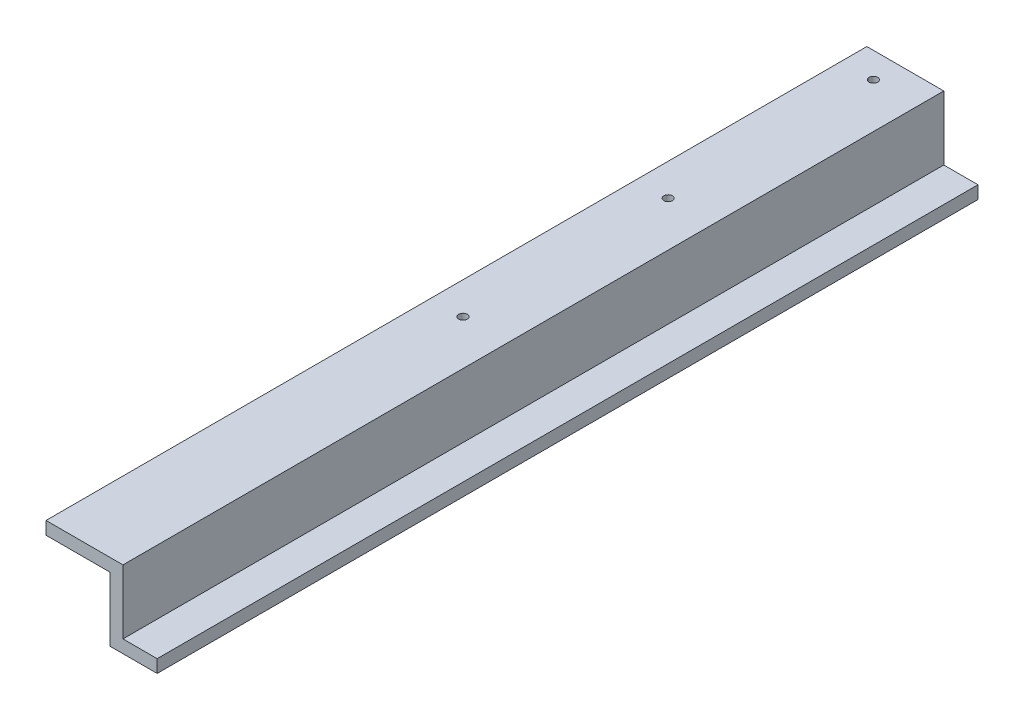
ISO-10303-21;
HEADER;
FILE_DESCRIPTION(('STEP AP214'),'2;1');
FILE_NAME('part.step','',(''),(''),'','','');
FILE_SCHEMA(('AUTOMOTIVE_DESIGN { 1 0 10303 214 1 1 1 1 }'));
ENDSEC;
DATA;
#1=APPLICATION_CONTEXT('core data for automotive mechanical design processes');
#2=APPLICATION_PROTOCOL_DEFINITION('international standard','automotive_design',2000,#1);
#3=PRODUCT_CONTEXT('',#1,'mechanical');
#4=PRODUCT('Part','Part','',(#3));
#5=PRODUCT_RELATED_PRODUCT_CATEGORY('part','',(#4));
#6=PRODUCT_DEFINITION_FORMATION('','',#4);
#7=PRODUCT_DEFINITION_CONTEXT('part definition',#1,'design');
#8=PRODUCT_DEFINITION('design','',#6,#7);
#9=PRODUCT_DEFINITION_SHAPE('','',#8);
#10=(LENGTH_UNIT() NAMED_UNIT(*) SI_UNIT(.MILLI.,.METRE.));
#11=(NAMED_UNIT(*) PLANE_ANGLE_UNIT() SI_UNIT($,.RADIAN.));
#12=(NAMED_UNIT(*) SI_UNIT($,.STERADIAN.) SOLID_ANGLE_UNIT());
#13=UNCERTAINTY_MEASURE_WITH_UNIT(LENGTH_MEASURE(1.E-05),#10,'distance_accuracy_value','');
#14=(GEOMETRIC_REPRESENTATION_CONTEXT(3) GLOBAL_UNCERTAINTY_ASSIGNED_CONTEXT((#13)) GLOBAL_UNIT_ASSIGNED_CONTEXT((#10,
#11,#12)) REPRESENTATION_CONTEXT('',''));
#15=CARTESIAN_POINT('',(0.,0.,0.));
#16=DIRECTION('',(0.,0.,1.));
#17=DIRECTION('',(1.,0.,0.));
#18=AXIS2_PLACEMENT_3D('',#15,#16,#17);
#19=CARTESIAN_POINT('',(2.38125,-9.525,152.4));
#20=DIRECTION('',(0.,-1.,0.));
#21=DIRECTION('',(0.,0.,-1.));
#22=AXIS2_PLACEMENT_3D('',#19,#20,#21);
#23=PLANE('',#22);
#24=DIRECTION('',(0.,0.,-1.));
#25=VECTOR('',#24,1.);
#26=CARTESIAN_POINT('',(15.08125,-9.525,152.4));
#27=LINE('',#26,#25);
#28=CARTESIAN_POINT('',(15.08125,-9.525,152.4));
#29=VERTEX_POINT('',#28);
#30=CARTESIAN_POINT('',(15.08125,-9.525,-152.4));
#31=VERTEX_POINT('',#30);
#32=EDGE_CURVE('E121',#29,#31,#27,.T.);
#33=ORIENTED_EDGE('',*,*,#32,.T.);
#34=DIRECTION('',(-1.,0.,0.));
#35=VECTOR('',#34,1.);
#36=CARTESIAN_POINT('',(2.38125,-9.525,-152.4));
#37=LINE('',#36,#35);
#38=CARTESIAN_POINT('',(2.38125,-9.525,-152.4));
#39=VERTEX_POINT('',#38);
#40=EDGE_CURVE('E115',#31,#39,#37,.T.);
#41=ORIENTED_EDGE('',*,*,#40,.T.);
#42=DIRECTION('',(0.,0.,-1.));
#43=VECTOR('',#42,1.);
#44=CARTESIAN_POINT('',(2.38125,-9.525,152.4));
#45=LINE('',#44,#43);
#46=CARTESIAN_POINT('',(2.38125,-9.525,152.4));
#47=VERTEX_POINT('',#46);
#48=EDGE_CURVE('E11',#47,#39,#45,.T.);
#49=ORIENTED_EDGE('',*,*,#48,.F.);
#50=DIRECTION('',(-1.,0.,0.));
#51=VECTOR('',#50,1.);
#52=CARTESIAN_POINT('',(2.38125,-9.525,152.4));
#53=LINE('',#52,#51);
#54=EDGE_CURVE('E146',#29,#47,#53,.T.);
#55=ORIENTED_EDGE('',*,*,#54,.F.);
#56=EDGE_LOOP('',(#33,#41,#49,#55));
#57=FACE_BOUND('',#56,.T.);
#58=ADVANCED_FACE('F39',(#57),#23,.F.);
#59=CARTESIAN_POINT('',(2.38125,-9.525,152.4));
#60=DIRECTION('',(-1.,0.,0.));
#61=DIRECTION('',(0.,0.,1.));
#62=AXIS2_PLACEMENT_3D('',#59,#60,#61);
#63=PLANE('',#62);
#64=ORIENTED_EDGE('',*,*,#48,.T.);
#65=DIRECTION('',(0.,1.,0.));
#66=VECTOR('',#65,1.);
#67=CARTESIAN_POINT('',(2.38125,-9.525,-152.4));
#68=LINE('',#67,#66);
#69=CARTESIAN_POINT('',(2.38125,14.2875,-152.4));
#70=VERTEX_POINT('',#69);
#71=EDGE_CURVE('E105',#39,#70,#68,.T.);
#72=ORIENTED_EDGE('',*,*,#71,.T.);
#73=DIRECTION('',(0.,0.,-1.));
#74=VECTOR('',#73,1.);
#75=CARTESIAN_POINT('',(2.38125,14.2875,152.4));
#76=LINE('',#75,#74);
#77=CARTESIAN_POINT('',(2.38125,14.2875,152.4));
#78=VERTEX_POINT('',#77);
#79=EDGE_CURVE('E46',#78,#70,#76,.T.);
#80=ORIENTED_EDGE('',*,*,#79,.F.);
#81=DIRECTION('',(0.,1.,0.));
#82=VECTOR('',#81,1.);
#83=CARTESIAN_POINT('',(2.38125,-9.525,152.4));
#84=LINE('',#83,#82);
#85=EDGE_CURVE('E106',#47,#78,#84,.T.);
#86=ORIENTED_EDGE('',*,*,#85,.F.);
#87=EDGE_LOOP('',(#64,#72,#80,#86));
#88=FACE_BOUND('',#87,.T.);
#89=ADVANCED_FACE('F103',(#88),#63,.F.);
#90=CARTESIAN_POINT('',(2.38125,14.2875,152.4));
#91=DIRECTION('',(0.,-1.,0.));
#92=DIRECTION('',(0.,0.,-1.));
#93=AXIS2_PLACEMENT_3D('',#90,#91,#92);
#94=PLANE('',#93);
#95=CARTESIAN_POINT('',(-14.2875,14.2875,9.46387040341715));
#96=DIRECTION('',(0.,-1.,0.));
#97=DIRECTION('',(0.,0.,-1.));
#98=AXIS2_PLACEMENT_3D('',#95,#96,#97);
#99=CIRCLE('',#98,1.5875);
#100=CARTESIAN_POINT('',(-14.2875,14.2875,7.87637040341715));
#101=VERTEX_POINT('',#100);
#102=EDGE_CURVE('E122',#101,#101,#99,.T.);
#103=ORIENTED_EDGE('',*,*,#102,.T.);
#104=EDGE_LOOP('',(#103));
#105=FACE_BOUND('',#104,.T.);
#106=CARTESIAN_POINT('',(-14.2875,14.2875,-66.7361295965829));
#107=DIRECTION('',(0.,-1.,0.));
#108=DIRECTION('',(0.,0.,-1.));
#109=AXIS2_PLACEMENT_3D('',#106,#107,#108);
#110=CIRCLE('',#109,1.5875);
#111=CARTESIAN_POINT('',(-14.2875,14.2875,-68.3236295965829));
#112=VERTEX_POINT('',#111);
#113=EDGE_CURVE('E338',#112,#112,#110,.T.);
#114=ORIENTED_EDGE('',*,*,#113,.T.);
#115=EDGE_LOOP('',(#114));
#116=FACE_BOUND('',#115,.T.);
#117=CARTESIAN_POINT('',(-14.2875,14.2875,-142.936129596583));
#118=DIRECTION('',(0.,-1.,0.));
#119=DIRECTION('',(0.,0.,-1.));
#120=AXIS2_PLACEMENT_3D('',#117,#118,#119);
#121=CIRCLE('',#120,1.5875);
#122=CARTESIAN_POINT('',(-14.2875,14.2875,-144.523629596583));
#123=VERTEX_POINT('',#122);
#124=EDGE_CURVE('E128',#123,#123,#121,.T.);
#125=ORIENTED_EDGE('',*,*,#124,.T.);
#126=EDGE_LOOP('',(#125));
#127=FACE_BOUND('',#126,.T.);
#128=ORIENTED_EDGE('',*,*,#79,.T.);
#129=DIRECTION('',(-1.,0.,0.));
#130=VECTOR('',#129,1.);
#131=CARTESIAN_POINT('',(2.38125,14.2875,-152.4));
#132=LINE('',#131,#130);
#133=CARTESIAN_POINT('',(-26.19375,14.2875,-152.4));
#134=VERTEX_POINT('',#133);
#135=EDGE_CURVE('E119',#70,#134,#132,.T.);
#136=ORIENTED_EDGE('',*,*,#135,.T.);
#137=DIRECTION('',(0.,0.,-1.));
#138=VECTOR('',#137,1.);
#139=CARTESIAN_POINT('',(-26.19375,14.2875,152.4));
#140=LINE('',#139,#138);
#141=CARTESIAN_POINT('',(-26.19375,14.2875,152.4));
#142=VERTEX_POINT('',#141);
#143=EDGE_CURVE('E168',#142,#134,#140,.T.);
#144=ORIENTED_EDGE('',*,*,#143,.F.);
#145=DIRECTION('',(-1.,0.,0.));
#146=VECTOR('',#145,1.);
#147=CARTESIAN_POINT('',(2.38125,14.2875,152.4));
#148=LINE('',#147,#146);
#149=EDGE_CURVE('E149',#78,#142,#148,.T.);
#150=ORIENTED_EDGE('',*,*,#149,.F.);
#151=EDGE_LOOP('',(#128,#136,#144,#150));
#152=FACE_BOUND('',#151,.T.);
#153=ADVANCED_FACE('F171',(#105,#116,#127,#152),#94,.F.);
#154=CARTESIAN_POINT('',(-26.19375,14.2875,152.4));
#155=DIRECTION('',(1.,0.,0.));
#156=DIRECTION('',(0.,0.,-1.));
#157=AXIS2_PLACEMENT_3D('',#154,#155,#156);
#158=PLANE('',#157);
#159=ORIENTED_EDGE('',*,*,#143,.T.);
#160=DIRECTION('',(0.,-1.,0.));
#161=VECTOR('',#160,1.);
#162=CARTESIAN_POINT('',(-26.19375,14.2875,-152.4));
#163=LINE('',#162,#161);
#164=CARTESIAN_POINT('',(-26.19375,9.525,-152.4));
#165=VERTEX_POINT('',#164);
#166=EDGE_CURVE('E132',#134,#165,#163,.T.);
#167=ORIENTED_EDGE('',*,*,#166,.T.);
#168=DIRECTION('',(0.,0.,-1.));
#169=VECTOR('',#168,1.);
#170=CARTESIAN_POINT('',(-26.19375,9.525,152.4));
#171=LINE('',#170,#169);
#172=CARTESIAN_POINT('',(-26.19375,9.525,152.4));
#173=VERTEX_POINT('',#172);
#174=EDGE_CURVE('E166',#173,#165,#171,.T.);
#175=ORIENTED_EDGE('',*,*,#174,.F.);
#176=DIRECTION('',(0.,-1.,0.));
#177=VECTOR('',#176,1.);
#178=CARTESIAN_POINT('',(-26.19375,14.2875,152.4));
#179=LINE('',#178,#177);
#180=EDGE_CURVE('E151',#142,#173,#179,.T.);
#181=ORIENTED_EDGE('',*,*,#180,.F.);
#182=EDGE_LOOP('',(#159,#167,#175,#181));
#183=FACE_BOUND('',#182,.T.);
#184=ADVANCED_FACE('F179',(#183),#158,.F.);
#185=CARTESIAN_POINT('',(-2.38125,9.525,152.4));
#186=DIRECTION('',(0.,1.,0.));
#187=DIRECTION('',(0.,0.,1.));
#188=AXIS2_PLACEMENT_3D('',#185,#186,#187);
#189=PLANE('',#188);
#190=CARTESIAN_POINT('',(-14.2875,9.525,9.46387040341715));
#191=DIRECTION('',(0.,-1.,0.));
#192=DIRECTION('',(0.,0.,-1.));
#193=AXIS2_PLACEMENT_3D('',#190,#191,#192);
#194=CIRCLE('',#193,1.5875);
#195=CARTESIAN_POINT('',(-14.2875,9.525,7.87637040341715));
#196=VERTEX_POINT('',#195);
#197=EDGE_CURVE('E125',#196,#196,#194,.T.);
#198=ORIENTED_EDGE('',*,*,#197,.F.);
#199=EDGE_LOOP('',(#198));
#200=FACE_BOUND('',#199,.T.);
#201=CARTESIAN_POINT('',(-14.2875,9.525,-66.7361295965829));
#202=DIRECTION('',(0.,-1.,0.));
#203=DIRECTION('',(0.,0.,-1.));
#204=AXIS2_PLACEMENT_3D('',#201,#202,#203);
#205=CIRCLE('',#204,1.5875);
#206=CARTESIAN_POINT('',(-14.2875,9.525,-68.3236295965829));
#207=VERTEX_POINT('',#206);
#208=EDGE_CURVE('E335',#207,#207,#205,.T.);
#209=ORIENTED_EDGE('',*,*,#208,.F.);
#210=EDGE_LOOP('',(#209));
#211=FACE_BOUND('',#210,.T.);
#212=CARTESIAN_POINT('',(-14.2875,9.525,-142.936129596583));
#213=DIRECTION('',(0.,-1.,0.));
#214=DIRECTION('',(0.,0.,-1.));
#215=AXIS2_PLACEMENT_3D('',#212,#213,#214);
#216=CIRCLE('',#215,1.5875);
#217=CARTESIAN_POINT('',(-14.2875,9.525,-144.523629596583));
#218=VERTEX_POINT('',#217);
#219=EDGE_CURVE('E342',#218,#218,#216,.T.);
#220=ORIENTED_EDGE('',*,*,#219,.F.);
#221=EDGE_LOOP('',(#220));
#222=FACE_BOUND('',#221,.T.);
#223=ORIENTED_EDGE('',*,*,#174,.T.);
#224=DIRECTION('',(1.,0.,0.));
#225=VECTOR('',#224,1.);
#226=CARTESIAN_POINT('',(-2.38125,9.525,-152.4));
#227=LINE('',#226,#225);
#228=CARTESIAN_POINT('',(-2.38125,9.525,-152.4));
#229=VERTEX_POINT('',#228);
#230=EDGE_CURVE('E135',#165,#229,#227,.T.);
#231=ORIENTED_EDGE('',*,*,#230,.T.);
#232=DIRECTION('',(0.,0.,-1.));
#233=VECTOR('',#232,1.);
#234=CARTESIAN_POINT('',(-2.38125,9.525,152.4));
#235=LINE('',#234,#233);
#236=CARTESIAN_POINT('',(-2.38125,9.525,152.4));
#237=VERTEX_POINT('',#236);
#238=EDGE_CURVE('E164',#237,#229,#235,.T.);
#239=ORIENTED_EDGE('',*,*,#238,.F.);
#240=DIRECTION('',(1.,0.,0.));
#241=VECTOR('',#240,1.);
#242=CARTESIAN_POINT('',(-2.38125,9.525,152.4));
#243=LINE('',#242,#241);
#244=EDGE_CURVE('E153',#173,#237,#243,.T.);
#245=ORIENTED_EDGE('',*,*,#244,.F.);
#246=EDGE_LOOP('',(#223,#231,#239,#245));
#247=FACE_BOUND('',#246,.T.);
#248=ADVANCED_FACE('F182',(#200,#211,#222,#247),#189,.F.);
#249=CARTESIAN_POINT('',(-2.38125,-14.2875,152.4));
#250=DIRECTION('',(1.,0.,0.));
#251=DIRECTION('',(0.,0.,-1.));
#252=AXIS2_PLACEMENT_3D('',#249,#250,#251);
#253=PLANE('',#252);
#254=ORIENTED_EDGE('',*,*,#238,.T.);
#255=DIRECTION('',(0.,-1.,0.));
#256=VECTOR('',#255,1.);
#257=CARTESIAN_POINT('',(-2.38125,-14.2875,-152.4));
#258=LINE('',#257,#256);
#259=CARTESIAN_POINT('',(-2.38125,-14.2875,-152.4));
#260=VERTEX_POINT('',#259);
#261=EDGE_CURVE('E138',#229,#260,#258,.T.);
#262=ORIENTED_EDGE('',*,*,#261,.T.);
#263=DIRECTION('',(0.,0.,-1.));
#264=VECTOR('',#263,1.);
#265=CARTESIAN_POINT('',(-2.38125,-14.2875,152.4));
#266=LINE('',#265,#264);
#267=CARTESIAN_POINT('',(-2.38125,-14.2875,152.4));
#268=VERTEX_POINT('',#267);
#269=EDGE_CURVE('E162',#268,#260,#266,.T.);
#270=ORIENTED_EDGE('',*,*,#269,.F.);
#271=DIRECTION('',(0.,-1.,0.));
#272=VECTOR('',#271,1.);
#273=CARTESIAN_POINT('',(-2.38125,-14.2875,152.4));
#274=LINE('',#273,#272);
#275=EDGE_CURVE('E155',#237,#268,#274,.T.);
#276=ORIENTED_EDGE('',*,*,#275,.F.);
#277=EDGE_LOOP('',(#254,#262,#270,#276));
#278=FACE_BOUND('',#277,.T.);
#279=ADVANCED_FACE('F187',(#278),#253,.F.);
#280=CARTESIAN_POINT('',(-2.38125,-14.2875,152.4));
#281=DIRECTION('',(0.,1.,0.));
#282=DIRECTION('',(0.,0.,1.));
#283=AXIS2_PLACEMENT_3D('',#280,#281,#282);
#284=PLANE('',#283);
#285=ORIENTED_EDGE('',*,*,#269,.T.);
#286=DIRECTION('',(1.,0.,0.));
#287=VECTOR('',#286,1.);
#288=CARTESIAN_POINT('',(-2.38125,-14.2875,-152.4));
#289=LINE('',#288,#287);
#290=CARTESIAN_POINT('',(15.08125,-14.2875,-152.4));
#291=VERTEX_POINT('',#290);
#292=EDGE_CURVE('E141',#260,#291,#289,.T.);
#293=ORIENTED_EDGE('',*,*,#292,.T.);
#294=DIRECTION('',(0.,0.,-1.));
#295=VECTOR('',#294,1.);
#296=CARTESIAN_POINT('',(15.08125,-14.2875,152.4));
#297=LINE('',#296,#295);
#298=CARTESIAN_POINT('',(15.08125,-14.2875,152.4));
#299=VERTEX_POINT('',#298);
#300=EDGE_CURVE('E160',#299,#291,#297,.T.);
#301=ORIENTED_EDGE('',*,*,#300,.F.);
#302=DIRECTION('',(1.,0.,0.));
#303=VECTOR('',#302,1.);
#304=CARTESIAN_POINT('',(-2.38125,-14.2875,152.4));
#305=LINE('',#304,#303);
#306=EDGE_CURVE('E58',#268,#299,#305,.T.);
#307=ORIENTED_EDGE('',*,*,#306,.F.);
#308=EDGE_LOOP('',(#285,#293,#301,#307));
#309=FACE_BOUND('',#308,.T.);
#310=ADVANCED_FACE('F190',(#309),#284,.F.);
#311=CARTESIAN_POINT('',(15.08125,-9.525,152.4));
#312=DIRECTION('',(-1.,0.,0.));
#313=DIRECTION('',(0.,0.,1.));
#314=AXIS2_PLACEMENT_3D('',#311,#312,#313);
#315=PLANE('',#314);
#316=ORIENTED_EDGE('',*,*,#300,.T.);
#317=DIRECTION('',(0.,1.,0.));
#318=VECTOR('',#317,1.);
#319=CARTESIAN_POINT('',(15.08125,-9.525,-152.4));
#320=LINE('',#319,#318);
#321=EDGE_CURVE('E144',#291,#31,#320,.T.);
#322=ORIENTED_EDGE('',*,*,#321,.T.);
#323=ORIENTED_EDGE('',*,*,#32,.F.);
#324=DIRECTION('',(0.,1.,0.));
#325=VECTOR('',#324,1.);
#326=CARTESIAN_POINT('',(15.08125,-9.525,152.4));
#327=LINE('',#326,#325);
#328=EDGE_CURVE('E53',#299,#29,#327,.T.);
#329=ORIENTED_EDGE('',*,*,#328,.F.);
#330=EDGE_LOOP('',(#316,#322,#323,#329));
#331=FACE_BOUND('',#330,.T.);
#332=ADVANCED_FACE('F192',(#331),#315,.F.);
#333=CARTESIAN_POINT('',(0.,0.,152.4));
#334=DIRECTION('',(0.,0.,-1.));
#335=DIRECTION('',(-1.,0.,0.));
#336=AXIS2_PLACEMENT_3D('',#333,#334,#335);
#337=PLANE('',#336);
#338=ORIENTED_EDGE('',*,*,#54,.T.);
#339=ORIENTED_EDGE('',*,*,#85,.T.);
#340=ORIENTED_EDGE('',*,*,#149,.T.);
#341=ORIENTED_EDGE('',*,*,#180,.T.);
#342=ORIENTED_EDGE('',*,*,#244,.T.);
#343=ORIENTED_EDGE('',*,*,#275,.T.);
#344=ORIENTED_EDGE('',*,*,#306,.T.);
#345=ORIENTED_EDGE('',*,*,#328,.T.);
#346=EDGE_LOOP('',(#338,#339,#340,#341,#342,#343,#344,#345));
#347=FACE_BOUND('',#346,.T.);
#348=ADVANCED_FACE('F174',(#347),#337,.F.);
#349=CARTESIAN_POINT('',(0.,0.,-152.4));
#350=DIRECTION('',(0.,0.,-1.));
#351=DIRECTION('',(-1.,0.,0.));
#352=AXIS2_PLACEMENT_3D('',#349,#350,#351);
#353=PLANE('',#352);
#354=ORIENTED_EDGE('',*,*,#40,.F.);
#355=ORIENTED_EDGE('',*,*,#321,.F.);
#356=ORIENTED_EDGE('',*,*,#292,.F.);
#357=ORIENTED_EDGE('',*,*,#261,.F.);
#358=ORIENTED_EDGE('',*,*,#230,.F.);
#359=ORIENTED_EDGE('',*,*,#166,.F.);
#360=ORIENTED_EDGE('',*,*,#135,.F.);
#361=ORIENTED_EDGE('',*,*,#71,.F.);
#362=EDGE_LOOP('',(#354,#355,#356,#357,#358,#359,#360,#361));
#363=FACE_BOUND('',#362,.T.);
#364=ADVANCED_FACE('F113',(#363),#353,.T.);
#365=CARTESIAN_POINT('',(-14.2875,14.2875,-142.936129596583));
#366=DIRECTION('',(0.,-1.,0.));
#367=DIRECTION('',(0.,0.,-1.));
#368=AXIS2_PLACEMENT_3D('',#365,#366,#367);
#369=CYLINDRICAL_SURFACE('',#368,1.5875);
#370=CARTESIAN_POINT('',(-14.2875,14.2875,-144.523629596583));
#371=CARTESIAN_POINT('',(-14.2875,14.237890625,-144.523629596583));
#372=CARTESIAN_POINT('',(-14.2875,14.18828125,-144.523629596583));
#373=CARTESIAN_POINT('',(-14.2875,14.0890625,-144.523629596583));
#374=CARTESIAN_POINT('',(-14.2875,14.039453125,-144.523629596583));
#375=CARTESIAN_POINT('',(-14.2875,13.940234375,-144.523629596583));
#376=CARTESIAN_POINT('',(-14.2875,13.890625,-144.523629596583));
#377=CARTESIAN_POINT('',(-14.2875,13.79140625,-144.523629596583));
#378=CARTESIAN_POINT('',(-14.2875,13.741796875,-144.523629596583));
#379=CARTESIAN_POINT('',(-14.2875,13.642578125,-144.523629596583));
#380=CARTESIAN_POINT('',(-14.2875,13.59296875,-144.523629596583));
#381=CARTESIAN_POINT('',(-14.2875,13.49375,-144.523629596583));
#382=CARTESIAN_POINT('',(-14.2875,13.444140625,-144.523629596583));
#383=CARTESIAN_POINT('',(-14.2875,13.344921875,-144.523629596583));
#384=CARTESIAN_POINT('',(-14.2875,13.2953125,-144.523629596583));
#385=CARTESIAN_POINT('',(-14.2875,13.19609375,-144.523629596583));
#386=CARTESIAN_POINT('',(-14.2875,13.146484375,-144.523629596583));
#387=CARTESIAN_POINT('',(-14.2875,13.047265625,-144.523629596583));
#388=CARTESIAN_POINT('',(-14.2875,12.99765625,-144.523629596583));
#389=CARTESIAN_POINT('',(-14.2875,12.8984375,-144.523629596583));
#390=CARTESIAN_POINT('',(-14.2875,12.848828125,-144.523629596583));
#391=CARTESIAN_POINT('',(-14.2875,12.749609375,-144.523629596583));
#392=CARTESIAN_POINT('',(-14.2875,12.7,-144.523629596583));
#393=CARTESIAN_POINT('',(-14.2875,12.60078125,-144.523629596583));
#394=CARTESIAN_POINT('',(-14.2875,12.551171875,-144.523629596583));
#395=CARTESIAN_POINT('',(-14.2875,12.451953125,-144.523629596583));
#396=CARTESIAN_POINT('',(-14.2875,12.40234375,-144.523629596583));
#397=CARTESIAN_POINT('',(-14.2875,12.303125,-144.523629596583));
#398=CARTESIAN_POINT('',(-14.2875,12.253515625,-144.523629596583));
#399=CARTESIAN_POINT('',(-14.2875,12.154296875,-144.523629596583));
#400=CARTESIAN_POINT('',(-14.2875,12.1046875,-144.523629596583));
#401=CARTESIAN_POINT('',(-14.2875,12.00546875,-144.523629596583));
#402=CARTESIAN_POINT('',(-14.2875,11.955859375,-144.523629596583));
#403=CARTESIAN_POINT('',(-14.2875,11.856640625,-144.523629596583));
#404=CARTESIAN_POINT('',(-14.2875,11.80703125,-144.523629596583));
#405=CARTESIAN_POINT('',(-14.2875,11.7078125,-144.523629596583));
#406=CARTESIAN_POINT('',(-14.2875,11.658203125,-144.523629596583));
#407=CARTESIAN_POINT('',(-14.2875,11.558984375,-144.523629596583));
#408=CARTESIAN_POINT('',(-14.2875,11.509375,-144.523629596583));
#409=CARTESIAN_POINT('',(-14.2875,11.41015625,-144.523629596583));
#410=CARTESIAN_POINT('',(-14.2875,11.360546875,-144.523629596583));
#411=CARTESIAN_POINT('',(-14.2875,11.261328125,-144.523629596583));
#412=CARTESIAN_POINT('',(-14.2875,11.21171875,-144.523629596583));
#413=CARTESIAN_POINT('',(-14.2875,11.1125,-144.523629596583));
#414=CARTESIAN_POINT('',(-14.2875,11.062890625,-144.523629596583));
#415=CARTESIAN_POINT('',(-14.2875,10.963671875,-144.523629596583));
#416=CARTESIAN_POINT('',(-14.2875,10.9140625,-144.523629596583));
#417=CARTESIAN_POINT('',(-14.2875,10.81484375,-144.523629596583));
#418=CARTESIAN_POINT('',(-14.2875,10.765234375,-144.523629596583));
#419=CARTESIAN_POINT('',(-14.2875,10.666015625,-144.523629596583));
#420=CARTESIAN_POINT('',(-14.2875,10.61640625,-144.523629596583));
#421=CARTESIAN_POINT('',(-14.2875,10.5171875,-144.523629596583));
#422=CARTESIAN_POINT('',(-14.2875,10.467578125,-144.523629596583));
#423=CARTESIAN_POINT('',(-14.2875,10.368359375,-144.523629596583));
#424=CARTESIAN_POINT('',(-14.2875,10.31875,-144.523629596583));
#425=CARTESIAN_POINT('',(-14.2875,10.21953125,-144.523629596583));
#426=CARTESIAN_POINT('',(-14.2875,10.169921875,-144.523629596583));
#427=CARTESIAN_POINT('',(-14.2875,10.070703125,-144.523629596583));
#428=CARTESIAN_POINT('',(-14.2875,10.02109375,-144.523629596583));
#429=CARTESIAN_POINT('',(-14.2875,9.921875,-144.523629596583));
#430=CARTESIAN_POINT('',(-14.2875,9.872265625,-144.523629596583));
#431=CARTESIAN_POINT('',(-14.2875,9.773046875,-144.523629596583));
#432=CARTESIAN_POINT('',(-14.2875,9.7234375,-144.523629596583));
#433=CARTESIAN_POINT('',(-14.2875,9.62421875,-144.523629596583));
#434=CARTESIAN_POINT('',(-14.2875,9.574609375,-144.523629596583));
#435=CARTESIAN_POINT('',(-14.2875,9.525,-144.523629596583));
#436=B_SPLINE_CURVE_WITH_KNOTS('',3,(#370,#371,#372,#373,#374,#375,#376,#377,#378,#379,#380,
#381,#382,#383,#384,#385,#386,#387,#388,#389,#390,#391,#392,#393,#394,#395,#396,#397,#398,#399,
#400,#401,#402,#403,#404,#405,#406,#407,#408,#409,#410,#411,#412,#413,#414,#415,#416,#417,#418,
#419,#420,#421,#422,#423,#424,#425,#426,#427,#428,#429,#430,#431,#432,#433,#434,#435),
.UNSPECIFIED.,.F.,.F.,(4,2,2,2,2,2,2,2,2,2,2,2,2,2,2,2,2,2,2,2,2,2,2,2,2,2,2,2,2,2,2,2,4),(0.,
0.148828124999998,0.297656249999998,0.446484374999999,0.595312499999999,0.744140624999999,
0.892968749999999,1.041796875,1.190625,1.339453125,1.48828125,1.637109375,1.7859375,1.934765625,
2.08359375,2.232421875,2.38125,2.530078125,2.67890625,2.827734375,2.9765625,3.125390625,
3.27421875,3.423046875,3.571875,3.720703125,3.86953125,4.018359375,4.1671875,4.316015625,
4.46484375,4.613671875,4.7625),.UNSPECIFIED.);
#437=EDGE_CURVE('BSEAM251',#123,#218,#436,.T.);
#438=ORIENTED_EDGE('',*,*,#124,.F.);
#439=ORIENTED_EDGE('',*,*,#219,.T.);
#440=ORIENTED_EDGE('',*,*,#437,.T.);
#441=ORIENTED_EDGE('',*,*,#437,.F.);
#442=EDGE_LOOP('',(#438,#440,#439,#441));
#443=FACE_BOUND('',#442,.T.);
#444=ADVANCED_FACE('F251',(#443),#369,.F.);
#445=CARTESIAN_POINT('',(-14.2875,14.2875,-66.7361295965829));
#446=DIRECTION('',(0.,-1.,0.));
#447=DIRECTION('',(0.,0.,-1.));
#448=AXIS2_PLACEMENT_3D('',#445,#446,#447);
#449=CYLINDRICAL_SURFACE('',#448,1.5875);
#450=CARTESIAN_POINT('',(-14.2875,14.2875,-68.3236295965829));
#451=CARTESIAN_POINT('',(-14.2875,14.237890625,-68.3236295965829));
#452=CARTESIAN_POINT('',(-14.2875,14.18828125,-68.3236295965829));
#453=CARTESIAN_POINT('',(-14.2875,14.0890625,-68.3236295965829));
#454=CARTESIAN_POINT('',(-14.2875,14.039453125,-68.3236295965829));
#455=CARTESIAN_POINT('',(-14.2875,13.940234375,-68.3236295965829));
#456=CARTESIAN_POINT('',(-14.2875,13.890625,-68.3236295965829));
#457=CARTESIAN_POINT('',(-14.2875,13.79140625,-68.3236295965829));
#458=CARTESIAN_POINT('',(-14.2875,13.741796875,-68.3236295965829));
#459=CARTESIAN_POINT('',(-14.2875,13.642578125,-68.3236295965829));
#460=CARTESIAN_POINT('',(-14.2875,13.59296875,-68.3236295965829));
#461=CARTESIAN_POINT('',(-14.2875,13.49375,-68.3236295965829));
#462=CARTESIAN_POINT('',(-14.2875,13.444140625,-68.3236295965829));
#463=CARTESIAN_POINT('',(-14.2875,13.344921875,-68.3236295965829));
#464=CARTESIAN_POINT('',(-14.2875,13.2953125,-68.3236295965829));
#465=CARTESIAN_POINT('',(-14.2875,13.19609375,-68.3236295965829));
#466=CARTESIAN_POINT('',(-14.2875,13.146484375,-68.3236295965829));
#467=CARTESIAN_POINT('',(-14.2875,13.047265625,-68.3236295965829));
#468=CARTESIAN_POINT('',(-14.2875,12.99765625,-68.3236295965829));
#469=CARTESIAN_POINT('',(-14.2875,12.8984375,-68.3236295965829));
#470=CARTESIAN_POINT('',(-14.2875,12.848828125,-68.3236295965829));
#471=CARTESIAN_POINT('',(-14.2875,12.749609375,-68.3236295965829));
#472=CARTESIAN_POINT('',(-14.2875,12.7,-68.3236295965829));
#473=CARTESIAN_POINT('',(-14.2875,12.60078125,-68.3236295965829));
#474=CARTESIAN_POINT('',(-14.2875,12.551171875,-68.3236295965829));
#475=CARTESIAN_POINT('',(-14.2875,12.451953125,-68.3236295965829));
#476=CARTESIAN_POINT('',(-14.2875,12.40234375,-68.3236295965829));
#477=CARTESIAN_POINT('',(-14.2875,12.303125,-68.3236295965829));
#478=CARTESIAN_POINT('',(-14.2875,12.253515625,-68.3236295965829));
#479=CARTESIAN_POINT('',(-14.2875,12.154296875,-68.3236295965829));
#480=CARTESIAN_POINT('',(-14.2875,12.1046875,-68.3236295965829));
#481=CARTESIAN_POINT('',(-14.2875,12.00546875,-68.3236295965829));
#482=CARTESIAN_POINT('',(-14.2875,11.955859375,-68.3236295965829));
#483=CARTESIAN_POINT('',(-14.2875,11.856640625,-68.3236295965829));
#484=CARTESIAN_POINT('',(-14.2875,11.80703125,-68.3236295965829));
#485=CARTESIAN_POINT('',(-14.2875,11.7078125,-68.3236295965829));
#486=CARTESIAN_POINT('',(-14.2875,11.658203125,-68.3236295965829));
#487=CARTESIAN_POINT('',(-14.2875,11.558984375,-68.3236295965829));
#488=CARTESIAN_POINT('',(-14.2875,11.509375,-68.3236295965829));
#489=CARTESIAN_POINT('',(-14.2875,11.41015625,-68.3236295965829));
#490=CARTESIAN_POINT('',(-14.2875,11.360546875,-68.3236295965829));
#491=CARTESIAN_POINT('',(-14.2875,11.261328125,-68.3236295965829));
#492=CARTESIAN_POINT('',(-14.2875,11.21171875,-68.3236295965829));
#493=CARTESIAN_POINT('',(-14.2875,11.1125,-68.3236295965829));
#494=CARTESIAN_POINT('',(-14.2875,11.062890625,-68.3236295965829));
#495=CARTESIAN_POINT('',(-14.2875,10.963671875,-68.3236295965829));
#496=CARTESIAN_POINT('',(-14.2875,10.9140625,-68.3236295965829));
#497=CARTESIAN_POINT('',(-14.2875,10.81484375,-68.3236295965829));
#498=CARTESIAN_POINT('',(-14.2875,10.765234375,-68.3236295965829));
#499=CARTESIAN_POINT('',(-14.2875,10.666015625,-68.3236295965829));
#500=CARTESIAN_POINT('',(-14.2875,10.61640625,-68.3236295965829));
#501=CARTESIAN_POINT('',(-14.2875,10.5171875,-68.3236295965829));
#502=CARTESIAN_POINT('',(-14.2875,10.467578125,-68.3236295965829));
#503=CARTESIAN_POINT('',(-14.2875,10.368359375,-68.3236295965829));
#504=CARTESIAN_POINT('',(-14.2875,10.31875,-68.3236295965829));
#505=CARTESIAN_POINT('',(-14.2875,10.21953125,-68.3236295965829));
#506=CARTESIAN_POINT('',(-14.2875,10.169921875,-68.3236295965829));
#507=CARTESIAN_POINT('',(-14.2875,10.070703125,-68.3236295965829));
#508=CARTESIAN_POINT('',(-14.2875,10.02109375,-68.3236295965829));
#509=CARTESIAN_POINT('',(-14.2875,9.921875,-68.3236295965829));
#510=CARTESIAN_POINT('',(-14.2875,9.872265625,-68.3236295965829));
#511=CARTESIAN_POINT('',(-14.2875,9.773046875,-68.3236295965829));
#512=CARTESIAN_POINT('',(-14.2875,9.7234375,-68.3236295965829));
#513=CARTESIAN_POINT('',(-14.2875,9.62421875,-68.3236295965829));
#514=CARTESIAN_POINT('',(-14.2875,9.574609375,-68.3236295965829));
#515=CARTESIAN_POINT('',(-14.2875,9.525,-68.3236295965829));
#516=B_SPLINE_CURVE_WITH_KNOTS('',3,(#450,#451,#452,#453,#454,#455,#456,#457,#458,#459,#460,
#461,#462,#463,#464,#465,#466,#467,#468,#469,#470,#471,#472,#473,#474,#475,#476,#477,#478,#479,
#480,#481,#482,#483,#484,#485,#486,#487,#488,#489,#490,#491,#492,#493,#494,#495,#496,#497,#498,
#499,#500,#501,#502,#503,#504,#505,#506,#507,#508,#509,#510,#511,#512,#513,#514,#515),
.UNSPECIFIED.,.F.,.F.,(4,2,2,2,2,2,2,2,2,2,2,2,2,2,2,2,2,2,2,2,2,2,2,2,2,2,2,2,2,2,2,2,4),(0.,
0.148828124999998,0.297656249999998,0.446484374999999,0.595312499999999,0.744140624999999,
0.892968749999999,1.041796875,1.190625,1.339453125,1.48828125,1.637109375,1.7859375,1.934765625,
2.08359375,2.232421875,2.38125,2.530078125,2.67890625,2.827734375,2.9765625,3.125390625,
3.27421875,3.423046875,3.571875,3.720703125,3.86953125,4.018359375,4.1671875,4.316015625,
4.46484375,4.613671875,4.7625),.UNSPECIFIED.);
#517=EDGE_CURVE('BSEAM266',#112,#207,#516,.T.);
#518=ORIENTED_EDGE('',*,*,#113,.F.);
#519=ORIENTED_EDGE('',*,*,#208,.T.);
#520=ORIENTED_EDGE('',*,*,#517,.T.);
#521=ORIENTED_EDGE('',*,*,#517,.F.);
#522=EDGE_LOOP('',(#518,#520,#519,#521));
#523=FACE_BOUND('',#522,.T.);
#524=ADVANCED_FACE('F266',(#523),#449,.F.);
#525=CARTESIAN_POINT('',(-14.2875,14.2875,9.46387040341715));
#526=DIRECTION('',(0.,-1.,0.));
#527=DIRECTION('',(0.,0.,-1.));
#528=AXIS2_PLACEMENT_3D('',#525,#526,#527);
#529=CYLINDRICAL_SURFACE('',#528,1.5875);
#530=CARTESIAN_POINT('',(-14.2875,14.2875,7.87637040341715));
#531=CARTESIAN_POINT('',(-14.2875,14.237890625,7.87637040341715));
#532=CARTESIAN_POINT('',(-14.2875,14.18828125,7.87637040341715));
#533=CARTESIAN_POINT('',(-14.2875,14.0890625,7.87637040341715));
#534=CARTESIAN_POINT('',(-14.2875,14.039453125,7.87637040341715));
#535=CARTESIAN_POINT('',(-14.2875,13.940234375,7.87637040341715));
#536=CARTESIAN_POINT('',(-14.2875,13.890625,7.87637040341715));
#537=CARTESIAN_POINT('',(-14.2875,13.79140625,7.87637040341715));
#538=CARTESIAN_POINT('',(-14.2875,13.741796875,7.87637040341715));
#539=CARTESIAN_POINT('',(-14.2875,13.642578125,7.87637040341715));
#540=CARTESIAN_POINT('',(-14.2875,13.59296875,7.87637040341715));
#541=CARTESIAN_POINT('',(-14.2875,13.49375,7.87637040341715));
#542=CARTESIAN_POINT('',(-14.2875,13.444140625,7.87637040341715));
#543=CARTESIAN_POINT('',(-14.2875,13.344921875,7.87637040341715));
#544=CARTESIAN_POINT('',(-14.2875,13.2953125,7.87637040341715));
#545=CARTESIAN_POINT('',(-14.2875,13.19609375,7.87637040341715));
#546=CARTESIAN_POINT('',(-14.2875,13.146484375,7.87637040341715));
#547=CARTESIAN_POINT('',(-14.2875,13.047265625,7.87637040341715));
#548=CARTESIAN_POINT('',(-14.2875,12.99765625,7.87637040341715));
#549=CARTESIAN_POINT('',(-14.2875,12.8984375,7.87637040341715));
#550=CARTESIAN_POINT('',(-14.2875,12.848828125,7.87637040341715));
#551=CARTESIAN_POINT('',(-14.2875,12.749609375,7.87637040341715));
#552=CARTESIAN_POINT('',(-14.2875,12.7,7.87637040341715));
#553=CARTESIAN_POINT('',(-14.2875,12.60078125,7.87637040341715));
#554=CARTESIAN_POINT('',(-14.2875,12.551171875,7.87637040341715));
#555=CARTESIAN_POINT('',(-14.2875,12.451953125,7.87637040341715));
#556=CARTESIAN_POINT('',(-14.2875,12.40234375,7.87637040341715));
#557=CARTESIAN_POINT('',(-14.2875,12.303125,7.87637040341715));
#558=CARTESIAN_POINT('',(-14.2875,12.253515625,7.87637040341715));
#559=CARTESIAN_POINT('',(-14.2875,12.154296875,7.87637040341715));
#560=CARTESIAN_POINT('',(-14.2875,12.1046875,7.87637040341715));
#561=CARTESIAN_POINT('',(-14.2875,12.00546875,7.87637040341715));
#562=CARTESIAN_POINT('',(-14.2875,11.955859375,7.87637040341715));
#563=CARTESIAN_POINT('',(-14.2875,11.856640625,7.87637040341715));
#564=CARTESIAN_POINT('',(-14.2875,11.80703125,7.87637040341715));
#565=CARTESIAN_POINT('',(-14.2875,11.7078125,7.87637040341715));
#566=CARTESIAN_POINT('',(-14.2875,11.658203125,7.87637040341715));
#567=CARTESIAN_POINT('',(-14.2875,11.558984375,7.87637040341715));
#568=CARTESIAN_POINT('',(-14.2875,11.509375,7.87637040341715));
#569=CARTESIAN_POINT('',(-14.2875,11.41015625,7.87637040341715));
#570=CARTESIAN_POINT('',(-14.2875,11.360546875,7.87637040341715));
#571=CARTESIAN_POINT('',(-14.2875,11.261328125,7.87637040341715));
#572=CARTESIAN_POINT('',(-14.2875,11.21171875,7.87637040341715));
#573=CARTESIAN_POINT('',(-14.2875,11.1125,7.87637040341715));
#574=CARTESIAN_POINT('',(-14.2875,11.062890625,7.87637040341715));
#575=CARTESIAN_POINT('',(-14.2875,10.963671875,7.87637040341715));
#576=CARTESIAN_POINT('',(-14.2875,10.9140625,7.87637040341715));
#577=CARTESIAN_POINT('',(-14.2875,10.81484375,7.87637040341715));
#578=CARTESIAN_POINT('',(-14.2875,10.765234375,7.87637040341715));
#579=CARTESIAN_POINT('',(-14.2875,10.666015625,7.87637040341715));
#580=CARTESIAN_POINT('',(-14.2875,10.61640625,7.87637040341715));
#581=CARTESIAN_POINT('',(-14.2875,10.5171875,7.87637040341715));
#582=CARTESIAN_POINT('',(-14.2875,10.467578125,7.87637040341715));
#583=CARTESIAN_POINT('',(-14.2875,10.368359375,7.87637040341715));
#584=CARTESIAN_POINT('',(-14.2875,10.31875,7.87637040341715));
#585=CARTESIAN_POINT('',(-14.2875,10.21953125,7.87637040341715));
#586=CARTESIAN_POINT('',(-14.2875,10.169921875,7.87637040341715));
#587=CARTESIAN_POINT('',(-14.2875,10.070703125,7.87637040341715));
#588=CARTESIAN_POINT('',(-14.2875,10.02109375,7.87637040341715));
#589=CARTESIAN_POINT('',(-14.2875,9.921875,7.87637040341715));
#590=CARTESIAN_POINT('',(-14.2875,9.872265625,7.87637040341715));
#591=CARTESIAN_POINT('',(-14.2875,9.773046875,7.87637040341715));
#592=CARTESIAN_POINT('',(-14.2875,9.7234375,7.87637040341715));
#593=CARTESIAN_POINT('',(-14.2875,9.62421875,7.87637040341715));
#594=CARTESIAN_POINT('',(-14.2875,9.574609375,7.87637040341715));
#595=CARTESIAN_POINT('',(-14.2875,9.525,7.87637040341715));
#596=B_SPLINE_CURVE_WITH_KNOTS('',3,(#530,#531,#532,#533,#534,#535,#536,#537,#538,#539,#540,
#541,#542,#543,#544,#545,#546,#547,#548,#549,#550,#551,#552,#553,#554,#555,#556,#557,#558,#559,
#560,#561,#562,#563,#564,#565,#566,#567,#568,#569,#570,#571,#572,#573,#574,#575,#576,#577,#578,
#579,#580,#581,#582,#583,#584,#585,#586,#587,#588,#589,#590,#591,#592,#593,#594,#595),
.UNSPECIFIED.,.F.,.F.,(4,2,2,2,2,2,2,2,2,2,2,2,2,2,2,2,2,2,2,2,2,2,2,2,2,2,2,2,2,2,2,2,4),(0.,
0.148828124999998,0.297656249999998,0.446484374999999,0.595312499999999,0.744140624999999,
0.892968749999999,1.041796875,1.190625,1.339453125,1.48828125,1.637109375,1.7859375,1.934765625,
2.08359375,2.232421875,2.38125,2.530078125,2.67890625,2.827734375,2.9765625,3.125390625,
3.27421875,3.423046875,3.571875,3.720703125,3.86953125,4.018359375,4.1671875,4.316015625,
4.46484375,4.613671875,4.7625),.UNSPECIFIED.);
#597=EDGE_CURVE('BSEAM277',#101,#196,#596,.T.);
#598=ORIENTED_EDGE('',*,*,#102,.F.);
#599=ORIENTED_EDGE('',*,*,#197,.T.);
#600=ORIENTED_EDGE('',*,*,#597,.T.);
#601=ORIENTED_EDGE('',*,*,#597,.F.);
#602=EDGE_LOOP('',(#598,#600,#599,#601));
#603=FACE_BOUND('',#602,.T.);
#604=ADVANCED_FACE('F277',(#603),#529,.F.);
#605=CLOSED_SHELL('',(#58,#89,#153,#184,#248,#279,#310,#332,#348,#364,#444,#524,#604));
#606=MANIFOLD_SOLID_BREP('B2',#605);
#607=ADVANCED_BREP_SHAPE_REPRESENTATION('',(#18,#606),#14);
#608=SHAPE_DEFINITION_REPRESENTATION(#9,#607);
ENDSEC;
END-ISO-10303-21;
